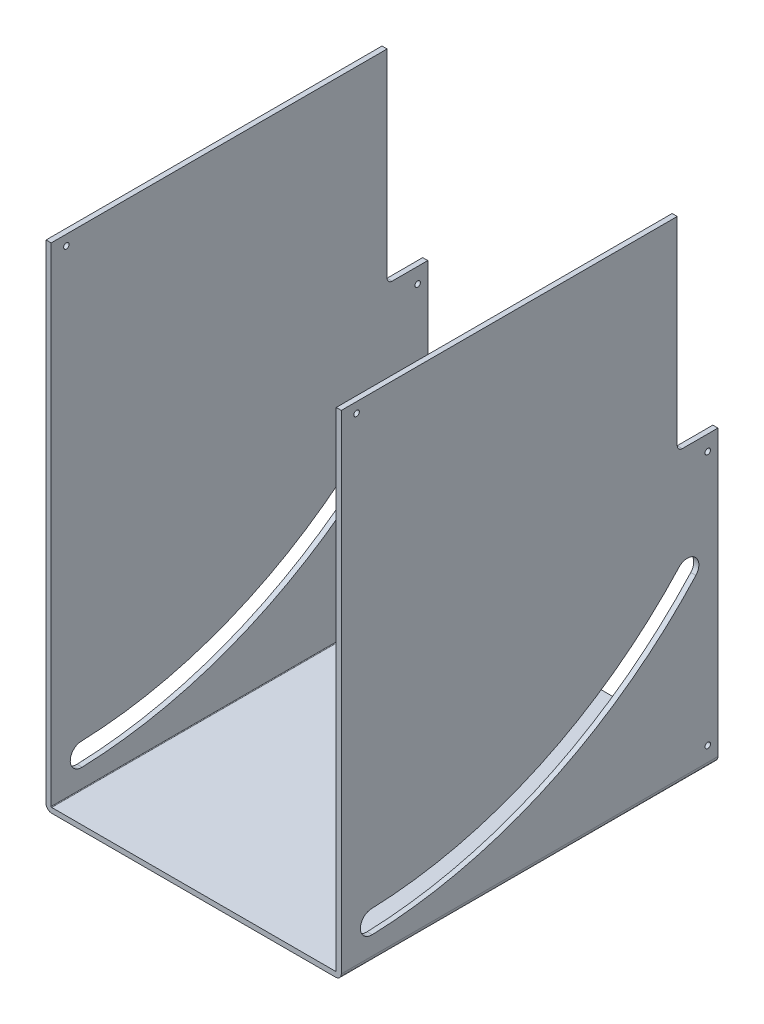
ISO-10303-21;
HEADER;
FILE_DESCRIPTION(('STEP AP214'),'2;1');
FILE_NAME('part.step','',(''),(''),'','','');
FILE_SCHEMA(('AUTOMOTIVE_DESIGN { 1 0 10303 214 1 1 1 1 }'));
ENDSEC;
DATA;
#1=APPLICATION_CONTEXT('core data for automotive mechanical design processes');
#2=APPLICATION_PROTOCOL_DEFINITION('international standard','automotive_design',2000,#1);
#3=PRODUCT_CONTEXT('',#1,'mechanical');
#4=PRODUCT('Part','Part','',(#3));
#5=PRODUCT_RELATED_PRODUCT_CATEGORY('part','',(#4));
#6=PRODUCT_DEFINITION_FORMATION('','',#4);
#7=PRODUCT_DEFINITION_CONTEXT('part definition',#1,'design');
#8=PRODUCT_DEFINITION('design','',#6,#7);
#9=PRODUCT_DEFINITION_SHAPE('','',#8);
#10=(LENGTH_UNIT() NAMED_UNIT(*) SI_UNIT(.MILLI.,.METRE.));
#11=(NAMED_UNIT(*) PLANE_ANGLE_UNIT() SI_UNIT($,.RADIAN.));
#12=(NAMED_UNIT(*) SI_UNIT($,.STERADIAN.) SOLID_ANGLE_UNIT());
#13=UNCERTAINTY_MEASURE_WITH_UNIT(LENGTH_MEASURE(1.E-05),#10,'distance_accuracy_value','');
#14=(GEOMETRIC_REPRESENTATION_CONTEXT(3) GLOBAL_UNCERTAINTY_ASSIGNED_CONTEXT((#13)) GLOBAL_UNIT_ASSIGNED_CONTEXT((#10,
#11,#12)) REPRESENTATION_CONTEXT('',''));
#15=CARTESIAN_POINT('',(0.,0.,0.));
#16=DIRECTION('',(0.,0.,1.));
#17=DIRECTION('',(1.,0.,0.));
#18=AXIS2_PLACEMENT_3D('',#15,#16,#17);
#19=CARTESIAN_POINT('',(361.95,-1.27444351368429E-12,0.));
#20=DIRECTION('',(1.,0.,0.));
#21=DIRECTION('',(0.,1.,0.));
#22=AXIS2_PLACEMENT_3D('',#19,#20,#21);
#23=PLANE('',#22);
#24=CARTESIAN_POINT('',(361.950000000002,603.25,-19.05));
#25=DIRECTION('',(-1.,0.,0.));
#26=DIRECTION('',(0.,-1.,0.));
#27=AXIS2_PLACEMENT_3D('',#24,#25,#26);
#28=CIRCLE('',#27,3.42900000000003);
#29=CARTESIAN_POINT('',(361.950000000002,599.821,-19.05));
#30=VERTEX_POINT('',#29);
#31=EDGE_CURVE('E196',#30,#30,#28,.F.);
#32=ORIENTED_EDGE('',*,*,#31,.T.);
#33=EDGE_LOOP('',(#32));
#34=FACE_BOUND('',#33,.T.);
#35=CARTESIAN_POINT('',(361.95,342.9,-457.2));
#36=DIRECTION('',(-1.,0.,0.));
#37=DIRECTION('',(0.,-1.,0.));
#38=AXIS2_PLACEMENT_3D('',#35,#36,#37);
#39=CIRCLE('',#38,3.42900000000003);
#40=CARTESIAN_POINT('',(361.95,339.471,-457.2));
#41=VERTEX_POINT('',#40);
#42=EDGE_CURVE('E322',#41,#41,#39,.F.);
#43=ORIENTED_EDGE('',*,*,#42,.T.);
#44=EDGE_LOOP('',(#43));
#45=FACE_BOUND('',#44,.T.);
#46=CARTESIAN_POINT('',(361.95,25.4000000000012,-457.2));
#47=DIRECTION('',(-1.,0.,0.));
#48=DIRECTION('',(0.,-1.,0.));
#49=AXIS2_PLACEMENT_3D('',#46,#47,#48);
#50=CIRCLE('',#49,3.429);
#51=CARTESIAN_POINT('',(361.95,21.9710000000012,-457.2));
#52=VERTEX_POINT('',#51);
#53=EDGE_CURVE('E319',#52,#52,#50,.F.);
#54=ORIENTED_EDGE('',*,*,#53,.T.);
#55=EDGE_LOOP('',(#54));
#56=FACE_BOUND('',#55,.T.);
#57=CARTESIAN_POINT('',(361.95,44.4500000000012,-38.1));
#58=DIRECTION('',(-1.,0.,0.));
#59=DIRECTION('',(0.,-1.,0.));
#60=AXIS2_PLACEMENT_3D('',#57,#58,#59);
#61=CIRCLE('',#60,14.2875);
#62=CARTESIAN_POINT('',(361.95,58.7292048343176,-37.6132089261029));
#63=VERTEX_POINT('',#62);
#64=CARTESIAN_POINT('',(361.950000000003,30.1707951656841,-38.5867910738975));
#65=VERTEX_POINT('',#64);
#66=EDGE_CURVE('E317',#63,#65,#61,.F.);
#67=ORIENTED_EDGE('',*,*,#66,.T.);
#68=CARTESIAN_POINT('',(361.950000000003,603.25,-19.05));
#69=DIRECTION('',(-1.,0.,0.));
#70=DIRECTION('',(0.,-1.,0.));
#71=AXIS2_PLACEMENT_3D('',#68,#69,#70);
#72=CIRCLE('',#71,573.412121618472);
#73=CARTESIAN_POINT('',(361.950000000002,216.441271372631,-442.347139934439));
#74=VERTEX_POINT('',#73);
#75=EDGE_CURVE('E307',#65,#74,#72,.F.);
#76=ORIENTED_EDGE('',*,*,#75,.T.);
#77=CARTESIAN_POINT('',(361.95,226.079242915097,-431.8));
#78=DIRECTION('',(-1.,0.,0.));
#79=DIRECTION('',(0.,-1.,0.));
#80=AXIS2_PLACEMENT_3D('',#77,#78,#79);
#81=CIRCLE('',#80,14.2875);
#82=CARTESIAN_POINT('',(361.95,235.717214457562,-421.252860065562));
#83=VERTEX_POINT('',#82);
#84=EDGE_CURVE('E311',#74,#83,#81,.F.);
#85=ORIENTED_EDGE('',*,*,#84,.T.);
#86=CARTESIAN_POINT('',(361.949999999998,603.25,-19.05));
#87=DIRECTION('',(-1.,0.,0.));
#88=DIRECTION('',(0.,-1.,0.));
#89=AXIS2_PLACEMENT_3D('',#86,#87,#88);
#90=CIRCLE('',#89,544.837121618472);
#91=EDGE_CURVE('E313',#63,#83,#90,.F.);
#92=ORIENTED_EDGE('',*,*,#91,.F.);
#93=EDGE_LOOP('',(#67,#76,#85,#92));
#94=FACE_BOUND('',#93,.T.);
#95=DIRECTION('',(0.,-1.,0.));
#96=VECTOR('',#95,1.);
#97=CARTESIAN_POINT('',(361.950000000002,615.95,-419.1));
#98=LINE('',#97,#96);
#99=CARTESIAN_POINT('',(361.950000000002,615.95,-419.1));
#100=VERTEX_POINT('',#99);
#101=CARTESIAN_POINT('',(361.950000000001,368.300000000003,-419.1));
#102=VERTEX_POINT('',#101);
#103=EDGE_CURVE('E165',#100,#102,#98,.T.);
#104=ORIENTED_EDGE('',*,*,#103,.T.);
#105=CARTESIAN_POINT('',(361.95,368.300000000003,-425.45));
#106=DIRECTION('',(1.,0.,0.));
#107=DIRECTION('',(0.,1.,0.));
#108=AXIS2_PLACEMENT_3D('',#105,#106,#107);
#109=CIRCLE('',#108,6.35000000000002);
#110=CARTESIAN_POINT('',(361.95,361.950000000001,-425.45));
#111=VERTEX_POINT('',#110);
#112=EDGE_CURVE('E20',#102,#111,#109,.T.);
#113=ORIENTED_EDGE('',*,*,#112,.T.);
#114=DIRECTION('',(0.,0.,1.));
#115=VECTOR('',#114,1.);
#116=CARTESIAN_POINT('',(361.95,361.95,-469.9));
#117=LINE('',#116,#115);
#118=CARTESIAN_POINT('',(361.95,361.95,-469.9));
#119=VERTEX_POINT('',#118);
#120=EDGE_CURVE('E169',#111,#119,#117,.F.);
#121=ORIENTED_EDGE('',*,*,#120,.T.);
#122=DIRECTION('',(0.,1.,0.));
#123=VECTOR('',#122,1.);
#124=CARTESIAN_POINT('',(361.95,6.34999999999997,-469.9));
#125=LINE('',#124,#123);
#126=CARTESIAN_POINT('',(361.95,7.08659999999999,-469.9));
#127=VERTEX_POINT('',#126);
#128=EDGE_CURVE('E376',#127,#119,#125,.T.);
#129=ORIENTED_EDGE('',*,*,#128,.F.);
#130=DIRECTION('',(0.,0.,-1.));
#131=VECTOR('',#130,1.);
#132=CARTESIAN_POINT('',(361.95,7.0866,-469.9));
#133=LINE('',#132,#131);
#134=CARTESIAN_POINT('',(361.950000000001,7.08659999999998,0.));
#135=VERTEX_POINT('',#134);
#136=EDGE_CURVE('E370',#127,#135,#133,.F.);
#137=ORIENTED_EDGE('',*,*,#136,.T.);
#138=DIRECTION('',(0.,1.,0.));
#139=VECTOR('',#138,1.);
#140=CARTESIAN_POINT('',(361.950000000002,615.95,0.));
#141=LINE('',#140,#139);
#142=CARTESIAN_POINT('',(361.950000000002,615.95,0.));
#143=VERTEX_POINT('',#142);
#144=EDGE_CURVE('E373',#143,#135,#141,.F.);
#145=ORIENTED_EDGE('',*,*,#144,.F.);
#146=DIRECTION('',(0.,0.,1.));
#147=VECTOR('',#146,1.);
#148=CARTESIAN_POINT('',(361.950000000002,615.95,-469.9));
#149=LINE('',#148,#147);
#150=EDGE_CURVE('E193',#100,#143,#149,.T.);
#151=ORIENTED_EDGE('',*,*,#150,.F.);
#152=EDGE_LOOP('',(#104,#113,#121,#129,#137,#145,#151));
#153=FACE_BOUND('',#152,.T.);
#154=ADVANCED_FACE('F17',(#34,#45,#56,#94,#153),#23,.F.);
#155=CARTESIAN_POINT('',(368.300000000003,361.95,-469.9));
#156=DIRECTION('',(0.,-1.,0.));
#157=DIRECTION('',(1.,0.,0.));
#158=AXIS2_PLACEMENT_3D('',#155,#156,#157);
#159=PLANE('',#158);
#160=DIRECTION('',(1.,0.,0.));
#161=VECTOR('',#160,1.);
#162=CARTESIAN_POINT('',(368.300000000003,361.950000000002,-425.45));
#163=LINE('',#162,#161);
#164=CARTESIAN_POINT('',(368.300000000003,361.950000000001,-425.45));
#165=VERTEX_POINT('',#164);
#166=EDGE_CURVE('E174',#111,#165,#163,.T.);
#167=ORIENTED_EDGE('',*,*,#166,.T.);
#168=DIRECTION('',(0.,0.,1.));
#169=VECTOR('',#168,1.);
#170=CARTESIAN_POINT('',(368.300000000001,361.95,0.));
#171=LINE('',#170,#169);
#172=CARTESIAN_POINT('',(368.300000000001,361.95,-469.9));
#173=VERTEX_POINT('',#172);
#174=EDGE_CURVE('E306',#173,#165,#171,.T.);
#175=ORIENTED_EDGE('',*,*,#174,.F.);
#176=DIRECTION('',(-1.,0.,0.));
#177=VECTOR('',#176,1.);
#178=CARTESIAN_POINT('',(368.3,361.95,-469.9));
#179=LINE('',#178,#177);
#180=EDGE_CURVE('E180',#119,#173,#179,.F.);
#181=ORIENTED_EDGE('',*,*,#180,.F.);
#182=ORIENTED_EDGE('',*,*,#120,.F.);
#183=EDGE_LOOP('',(#167,#175,#181,#182));
#184=FACE_BOUND('',#183,.T.);
#185=ADVANCED_FACE('F176',(#184),#159,.F.);
#186=CARTESIAN_POINT('',(368.300000000003,368.300000000003,-425.45));
#187=DIRECTION('',(1.,0.,0.));
#188=DIRECTION('',(0.,1.,0.));
#189=AXIS2_PLACEMENT_3D('',#186,#187,#188);
#190=CYLINDRICAL_SURFACE('',#189,6.35000000000002);
#191=ORIENTED_EDGE('',*,*,#166,.F.);
#192=ORIENTED_EDGE('',*,*,#112,.F.);
#193=DIRECTION('',(1.,0.,0.));
#194=VECTOR('',#193,1.);
#195=CARTESIAN_POINT('',(368.300000000003,368.300000000003,-419.1));
#196=LINE('',#195,#194);
#197=CARTESIAN_POINT('',(368.300000000002,368.300000000003,-419.1));
#198=VERTEX_POINT('',#197);
#199=EDGE_CURVE('E188',#102,#198,#196,.T.);
#200=ORIENTED_EDGE('',*,*,#199,.T.);
#201=CARTESIAN_POINT('',(368.300000000003,368.300000000003,-425.45));
#202=DIRECTION('',(1.,0.,0.));
#203=DIRECTION('',(0.,1.,0.));
#204=AXIS2_PLACEMENT_3D('',#201,#202,#203);
#205=CIRCLE('',#204,6.35000000000002);
#206=EDGE_CURVE('E185',#165,#198,#205,.F.);
#207=ORIENTED_EDGE('',*,*,#206,.F.);
#208=EDGE_LOOP('',(#191,#192,#200,#207));
#209=FACE_BOUND('',#208,.T.);
#210=ADVANCED_FACE('F183',(#209),#190,.F.);
#211=CARTESIAN_POINT('',(368.300000000003,615.95,-419.1));
#212=DIRECTION('',(0.,0.,1.));
#213=DIRECTION('',(0.,-1.,0.));
#214=AXIS2_PLACEMENT_3D('',#211,#212,#213);
#215=PLANE('',#214);
#216=ORIENTED_EDGE('',*,*,#199,.F.);
#217=ORIENTED_EDGE('',*,*,#103,.F.);
#218=DIRECTION('',(-1.,0.,0.));
#219=VECTOR('',#218,1.);
#220=CARTESIAN_POINT('',(368.300000000003,615.95,-419.1));
#221=LINE('',#220,#219);
#222=CARTESIAN_POINT('',(368.300000000002,615.95,-419.1));
#223=VERTEX_POINT('',#222);
#224=EDGE_CURVE('E197',#223,#100,#221,.T.);
#225=ORIENTED_EDGE('',*,*,#224,.F.);
#226=DIRECTION('',(0.,1.,0.));
#227=VECTOR('',#226,1.);
#228=CARTESIAN_POINT('',(368.3,-1.29661442018595E-12,-419.1));
#229=LINE('',#228,#227);
#230=EDGE_CURVE('E305',#198,#223,#229,.T.);
#231=ORIENTED_EDGE('',*,*,#230,.F.);
#232=EDGE_LOOP('',(#216,#217,#225,#231));
#233=FACE_BOUND('',#232,.T.);
#234=ADVANCED_FACE('F407',(#233),#215,.F.);
#235=CARTESIAN_POINT('',(368.300000000003,615.95,-469.9));
#236=DIRECTION('',(0.,1.,0.));
#237=DIRECTION('',(-1.,0.,0.));
#238=AXIS2_PLACEMENT_3D('',#235,#236,#237);
#239=PLANE('',#238);
#240=DIRECTION('',(1.,0.,0.));
#241=VECTOR('',#240,1.);
#242=CARTESIAN_POINT('',(368.300000000003,615.95,0.));
#243=LINE('',#242,#241);
#244=CARTESIAN_POINT('',(368.300000000002,615.95,0.));
#245=VERTEX_POINT('',#244);
#246=EDGE_CURVE('E372',#245,#143,#243,.F.);
#247=ORIENTED_EDGE('',*,*,#246,.F.);
#248=DIRECTION('',(0.,0.,1.));
#249=VECTOR('',#248,1.);
#250=CARTESIAN_POINT('',(368.300000000002,615.95,0.));
#251=LINE('',#250,#249);
#252=EDGE_CURVE('E363',#223,#245,#251,.T.);
#253=ORIENTED_EDGE('',*,*,#252,.F.);
#254=ORIENTED_EDGE('',*,*,#224,.T.);
#255=ORIENTED_EDGE('',*,*,#150,.T.);
#256=EDGE_LOOP('',(#247,#253,#254,#255));
#257=FACE_BOUND('',#256,.T.);
#258=ADVANCED_FACE('F333',(#257),#239,.T.);
#259=CARTESIAN_POINT('',(368.300000000003,603.25,-19.05));
#260=DIRECTION('',(-1.,0.,0.));
#261=DIRECTION('',(0.,-1.,0.));
#262=AXIS2_PLACEMENT_3D('',#259,#260,#261);
#263=CYLINDRICAL_SURFACE('',#262,3.42900000000003);
#264=ORIENTED_EDGE('',*,*,#31,.F.);
#265=EDGE_LOOP('',(#264));
#266=FACE_BOUND('',#265,.T.);
#267=CARTESIAN_POINT('',(368.300000000003,603.25,-19.05));
#268=DIRECTION('',(-1.,0.,0.));
#269=DIRECTION('',(0.,-1.,0.));
#270=AXIS2_PLACEMENT_3D('',#267,#268,#269);
#271=CIRCLE('',#270,3.42900000000003);
#272=CARTESIAN_POINT('',(368.300000000003,599.821,-19.05));
#273=VERTEX_POINT('',#272);
#274=EDGE_CURVE('E300',#273,#273,#271,.T.);
#275=ORIENTED_EDGE('',*,*,#274,.F.);
#276=EDGE_LOOP('',(#275));
#277=FACE_BOUND('',#276,.T.);
#278=ADVANCED_FACE('F329',(#266,#277),#263,.F.);
#279=CARTESIAN_POINT('',(368.300000000003,342.9,-457.2));
#280=DIRECTION('',(-1.,0.,0.));
#281=DIRECTION('',(0.,-1.,0.));
#282=AXIS2_PLACEMENT_3D('',#279,#280,#281);
#283=CYLINDRICAL_SURFACE('',#282,3.42900000000003);
#284=ORIENTED_EDGE('',*,*,#42,.F.);
#285=EDGE_LOOP('',(#284));
#286=FACE_BOUND('',#285,.T.);
#287=CARTESIAN_POINT('',(368.300000000003,342.9,-457.2));
#288=DIRECTION('',(-1.,0.,0.));
#289=DIRECTION('',(0.,-1.,0.));
#290=AXIS2_PLACEMENT_3D('',#287,#288,#289);
#291=CIRCLE('',#290,3.42900000000003);
#292=CARTESIAN_POINT('',(368.300000000003,339.471,-457.2));
#293=VERTEX_POINT('',#292);
#294=EDGE_CURVE('E297',#293,#293,#291,.T.);
#295=ORIENTED_EDGE('',*,*,#294,.F.);
#296=EDGE_LOOP('',(#295));
#297=FACE_BOUND('',#296,.T.);
#298=ADVANCED_FACE('F332',(#286,#297),#283,.F.);
#299=CARTESIAN_POINT('',(368.300000000005,25.4000000000013,-457.2));
#300=DIRECTION('',(-1.,0.,0.));
#301=DIRECTION('',(0.,-1.,0.));
#302=AXIS2_PLACEMENT_3D('',#299,#300,#301);
#303=CYLINDRICAL_SURFACE('',#302,3.429);
#304=ORIENTED_EDGE('',*,*,#53,.F.);
#305=EDGE_LOOP('',(#304));
#306=FACE_BOUND('',#305,.T.);
#307=CARTESIAN_POINT('',(368.300000000005,25.4000000000013,-457.2));
#308=DIRECTION('',(-1.,0.,0.));
#309=DIRECTION('',(0.,-1.,0.));
#310=AXIS2_PLACEMENT_3D('',#307,#308,#309);
#311=CIRCLE('',#310,3.429);
#312=CARTESIAN_POINT('',(368.300000000005,21.9710000000013,-457.2));
#313=VERTEX_POINT('',#312);
#314=EDGE_CURVE('E294',#313,#313,#311,.T.);
#315=ORIENTED_EDGE('',*,*,#314,.F.);
#316=EDGE_LOOP('',(#315));
#317=FACE_BOUND('',#316,.T.);
#318=ADVANCED_FACE('F772',(#306,#317),#303,.F.);
#319=CARTESIAN_POINT('',(368.300000000005,44.4500000000013,-38.1));
#320=DIRECTION('',(-1.,0.,0.));
#321=DIRECTION('',(0.,-1.,0.));
#322=AXIS2_PLACEMENT_3D('',#319,#320,#321);
#323=CYLINDRICAL_SURFACE('',#322,14.2875);
#324=DIRECTION('',(-1.,0.,0.));
#325=VECTOR('',#324,1.);
#326=CARTESIAN_POINT('',(368.300000000007,30.1707951656837,-38.5867910738979));
#327=LINE('',#326,#325);
#328=CARTESIAN_POINT('',(368.300000000005,30.1707951656841,-38.5867910738975));
#329=VERTEX_POINT('',#328);
#330=EDGE_CURVE('E383',#329,#65,#327,.T.);
#331=ORIENTED_EDGE('',*,*,#330,.T.);
#332=ORIENTED_EDGE('',*,*,#66,.F.);
#333=DIRECTION('',(-1.,0.,0.));
#334=VECTOR('',#333,1.);
#335=CARTESIAN_POINT('',(368.300000000007,58.7292048343172,-37.613208926103));
#336=LINE('',#335,#334);
#337=CARTESIAN_POINT('',(368.300000000003,58.7292048343172,-37.613208926103));
#338=VERTEX_POINT('',#337);
#339=EDGE_CURVE('E316',#338,#63,#336,.T.);
#340=ORIENTED_EDGE('',*,*,#339,.F.);
#341=CARTESIAN_POINT('',(368.300000000005,44.4500000000013,-38.1));
#342=DIRECTION('',(-1.,0.,0.));
#343=DIRECTION('',(0.,-1.,0.));
#344=AXIS2_PLACEMENT_3D('',#341,#342,#343);
#345=CIRCLE('',#344,14.2875);
#346=EDGE_CURVE('E291',#329,#338,#345,.T.);
#347=ORIENTED_EDGE('',*,*,#346,.F.);
#348=EDGE_LOOP('',(#331,#332,#340,#347));
#349=FACE_BOUND('',#348,.T.);
#350=ADVANCED_FACE('F763',(#349),#323,.F.);
#351=CARTESIAN_POINT('',(368.300000000005,603.25,-19.05));
#352=DIRECTION('',(-1.,0.,0.));
#353=DIRECTION('',(0.,-1.,0.));
#354=AXIS2_PLACEMENT_3D('',#351,#352,#353);
#355=CYLINDRICAL_SURFACE('',#354,544.837121618472);
#356=ORIENTED_EDGE('',*,*,#339,.T.);
#357=ORIENTED_EDGE('',*,*,#91,.T.);
#358=DIRECTION('',(-1.,0.,0.));
#359=VECTOR('',#358,1.);
#360=CARTESIAN_POINT('',(368.300000000005,235.717214457562,-421.252860065562));
#361=LINE('',#360,#359);
#362=CARTESIAN_POINT('',(368.3,235.717214457562,-421.252860065562));
#363=VERTEX_POINT('',#362);
#364=EDGE_CURVE('E310',#83,#363,#361,.F.);
#365=ORIENTED_EDGE('',*,*,#364,.T.);
#366=CARTESIAN_POINT('',(368.299999999999,603.25,-19.05));
#367=DIRECTION('',(-1.,0.,0.));
#368=DIRECTION('',(0.,-1.,0.));
#369=AXIS2_PLACEMENT_3D('',#366,#367,#368);
#370=CIRCLE('',#369,544.837121618472);
#371=EDGE_CURVE('E288',#338,#363,#370,.F.);
#372=ORIENTED_EDGE('',*,*,#371,.F.);
#373=EDGE_LOOP('',(#356,#357,#365,#372));
#374=FACE_BOUND('',#373,.T.);
#375=ADVANCED_FACE('F754',(#374),#355,.T.);
#376=CARTESIAN_POINT('',(368.300000000005,226.079242915097,-431.8));
#377=DIRECTION('',(-1.,0.,0.));
#378=DIRECTION('',(0.,-1.,0.));
#379=AXIS2_PLACEMENT_3D('',#376,#377,#378);
#380=CYLINDRICAL_SURFACE('',#379,14.2875);
#381=CARTESIAN_POINT('',(368.3,226.079242915097,-431.8));
#382=DIRECTION('',(-1.,0.,0.));
#383=DIRECTION('',(0.,-1.,0.));
#384=AXIS2_PLACEMENT_3D('',#381,#382,#383);
#385=CIRCLE('',#384,14.2875);
#386=CARTESIAN_POINT('',(368.300000000003,216.441271372631,-442.347139934439));
#387=VERTEX_POINT('',#386);
#388=EDGE_CURVE('E285',#363,#387,#385,.T.);
#389=ORIENTED_EDGE('',*,*,#388,.F.);
#390=ORIENTED_EDGE('',*,*,#364,.F.);
#391=ORIENTED_EDGE('',*,*,#84,.F.);
#392=DIRECTION('',(-1.,0.,0.));
#393=VECTOR('',#392,1.);
#394=CARTESIAN_POINT('',(368.300000000006,216.441271372631,-442.347139934439));
#395=LINE('',#394,#393);
#396=EDGE_CURVE('E309',#74,#387,#395,.F.);
#397=ORIENTED_EDGE('',*,*,#396,.T.);
#398=EDGE_LOOP('',(#389,#390,#391,#397));
#399=FACE_BOUND('',#398,.T.);
#400=ADVANCED_FACE('F745',(#399),#380,.F.);
#401=CARTESIAN_POINT('',(368.300000000005,603.25,-19.05));
#402=DIRECTION('',(-1.,0.,0.));
#403=DIRECTION('',(0.,-1.,0.));
#404=AXIS2_PLACEMENT_3D('',#401,#402,#403);
#405=CYLINDRICAL_SURFACE('',#404,573.412121618472);
#406=CARTESIAN_POINT('',(368.300000000004,603.25,-19.05));
#407=DIRECTION('',(-1.,0.,0.));
#408=DIRECTION('',(0.,-1.,0.));
#409=AXIS2_PLACEMENT_3D('',#406,#407,#408);
#410=CIRCLE('',#409,573.412121618472);
#411=EDGE_CURVE('E282',#387,#329,#410,.T.);
#412=ORIENTED_EDGE('',*,*,#411,.F.);
#413=ORIENTED_EDGE('',*,*,#396,.F.);
#414=ORIENTED_EDGE('',*,*,#75,.F.);
#415=ORIENTED_EDGE('',*,*,#330,.F.);
#416=EDGE_LOOP('',(#412,#413,#414,#415));
#417=FACE_BOUND('',#416,.T.);
#418=ADVANCED_FACE('F736',(#417),#405,.F.);
#419=CARTESIAN_POINT('',(361.2134,7.0866,-469.9));
#420=DIRECTION('',(0.,0.,-1.));
#421=DIRECTION('',(-1.,0.,0.));
#422=AXIS2_PLACEMENT_3D('',#419,#420,#421);
#423=CYLINDRICAL_SURFACE('',#422,0.736599999999977);
#424=CARTESIAN_POINT('',(361.2134,7.0866,0.));
#425=DIRECTION('',(0.,0.,-1.));
#426=DIRECTION('',(-1.,0.,0.));
#427=AXIS2_PLACEMENT_3D('',#424,#425,#426);
#428=CIRCLE('',#427,0.736599999999977);
#429=CARTESIAN_POINT('',(361.2134,6.35000000000001,0.));
#430=VERTEX_POINT('',#429);
#431=EDGE_CURVE('E277',#135,#430,#428,.T.);
#432=ORIENTED_EDGE('',*,*,#431,.F.);
#433=ORIENTED_EDGE('',*,*,#136,.F.);
#434=CARTESIAN_POINT('',(361.2134,7.0866,-469.9));
#435=DIRECTION('',(0.,0.,-1.));
#436=DIRECTION('',(-1.,0.,0.));
#437=AXIS2_PLACEMENT_3D('',#434,#435,#436);
#438=CIRCLE('',#437,0.736599999999977);
#439=CARTESIAN_POINT('',(361.2134,6.35000000000001,-469.9));
#440=VERTEX_POINT('',#439);
#441=EDGE_CURVE('E280',#127,#440,#438,.T.);
#442=ORIENTED_EDGE('',*,*,#441,.T.);
#443=DIRECTION('',(0.,0.,-1.));
#444=VECTOR('',#443,1.);
#445=CARTESIAN_POINT('',(361.2134,6.35,0.));
#446=LINE('',#445,#444);
#447=EDGE_CURVE('E276',#440,#430,#446,.F.);
#448=ORIENTED_EDGE('',*,*,#447,.T.);
#449=EDGE_LOOP('',(#432,#433,#442,#448));
#450=FACE_BOUND('',#449,.T.);
#451=ADVANCED_FACE('F341',(#450),#423,.F.);
#452=CARTESIAN_POINT('',(368.3,-1.29661442018595E-12,0.));
#453=DIRECTION('',(1.,0.,0.));
#454=DIRECTION('',(0.,1.,0.));
#455=AXIS2_PLACEMENT_3D('',#452,#453,#454);
#456=PLANE('',#455);
#457=ORIENTED_EDGE('',*,*,#388,.T.);
#458=ORIENTED_EDGE('',*,*,#411,.T.);
#459=ORIENTED_EDGE('',*,*,#346,.T.);
#460=ORIENTED_EDGE('',*,*,#371,.T.);
#461=EDGE_LOOP('',(#457,#458,#459,#460));
#462=FACE_BOUND('',#461,.T.);
#463=ORIENTED_EDGE('',*,*,#314,.T.);
#464=EDGE_LOOP('',(#463));
#465=FACE_BOUND('',#464,.T.);
#466=ORIENTED_EDGE('',*,*,#294,.T.);
#467=EDGE_LOOP('',(#466));
#468=FACE_BOUND('',#467,.T.);
#469=ORIENTED_EDGE('',*,*,#274,.T.);
#470=EDGE_LOOP('',(#469));
#471=FACE_BOUND('',#470,.T.);
#472=DIRECTION('',(0.,0.,-1.));
#473=VECTOR('',#472,1.);
#474=CARTESIAN_POINT('',(368.3,7.08659999999998,-469.9));
#475=LINE('',#474,#473);
#476=CARTESIAN_POINT('',(368.3,7.08659999999998,-469.9));
#477=VERTEX_POINT('',#476);
#478=CARTESIAN_POINT('',(368.3,7.08659999999998,0.));
#479=VERTEX_POINT('',#478);
#480=EDGE_CURVE('E272',#477,#479,#475,.F.);
#481=ORIENTED_EDGE('',*,*,#480,.F.);
#482=DIRECTION('',(0.,1.,0.));
#483=VECTOR('',#482,1.);
#484=CARTESIAN_POINT('',(368.3,-1.29661442018595E-12,-469.9));
#485=LINE('',#484,#483);
#486=EDGE_CURVE('E303',#477,#173,#485,.T.);
#487=ORIENTED_EDGE('',*,*,#486,.T.);
#488=ORIENTED_EDGE('',*,*,#174,.T.);
#489=ORIENTED_EDGE('',*,*,#206,.T.);
#490=ORIENTED_EDGE('',*,*,#230,.T.);
#491=ORIENTED_EDGE('',*,*,#252,.T.);
#492=DIRECTION('',(0.,1.,0.));
#493=VECTOR('',#492,1.);
#494=CARTESIAN_POINT('',(368.3,-1.29661442018595E-12,0.));
#495=LINE('',#494,#493);
#496=EDGE_CURVE('E349',#245,#479,#495,.F.);
#497=ORIENTED_EDGE('',*,*,#496,.T.);
#498=EDGE_LOOP('',(#481,#487,#488,#489,#490,#491,#497));
#499=FACE_BOUND('',#498,.T.);
#500=ADVANCED_FACE('F337',(#462,#465,#468,#471,#499),#456,.T.);
#501=CARTESIAN_POINT('',(0.,6.35,0.));
#502=DIRECTION('',(0.,-1.,0.));
#503=DIRECTION('',(0.,0.,-1.));
#504=AXIS2_PLACEMENT_3D('',#501,#502,#503);
#505=PLANE('',#504);
#506=DIRECTION('',(-1.,0.,0.));
#507=VECTOR('',#506,1.);
#508=CARTESIAN_POINT('',(0.,6.35,0.));
#509=LINE('',#508,#507);
#510=CARTESIAN_POINT('',(7.0866,6.35,0.));
#511=VERTEX_POINT('',#510);
#512=EDGE_CURVE('E418',#511,#430,#509,.F.);
#513=ORIENTED_EDGE('',*,*,#512,.T.);
#514=ORIENTED_EDGE('',*,*,#447,.F.);
#515=DIRECTION('',(1.,0.,0.));
#516=VECTOR('',#515,1.);
#517=CARTESIAN_POINT('',(0.,6.35000000000002,-469.9));
#518=LINE('',#517,#516);
#519=CARTESIAN_POINT('',(7.0866,6.35000000000001,-469.9));
#520=VERTEX_POINT('',#519);
#521=EDGE_CURVE('E271',#440,#520,#518,.F.);
#522=ORIENTED_EDGE('',*,*,#521,.T.);
#523=DIRECTION('',(0.,0.,1.));
#524=VECTOR('',#523,1.);
#525=CARTESIAN_POINT('',(7.0866,6.35,0.));
#526=LINE('',#525,#524);
#527=EDGE_CURVE('E421',#520,#511,#526,.T.);
#528=ORIENTED_EDGE('',*,*,#527,.T.);
#529=EDGE_LOOP('',(#513,#514,#522,#528));
#530=FACE_BOUND('',#529,.T.);
#531=ADVANCED_FACE('F340',(#530),#505,.F.);
#532=CARTESIAN_POINT('',(361.2134,7.0866,-469.9));
#533=DIRECTION('',(0.,0.,-1.));
#534=DIRECTION('',(-1.,0.,0.));
#535=AXIS2_PLACEMENT_3D('',#532,#533,#534);
#536=CYLINDRICAL_SURFACE('',#535,7.0866);
#537=ORIENTED_EDGE('',*,*,#480,.T.);
#538=CARTESIAN_POINT('',(361.2134,7.0866,0.));
#539=DIRECTION('',(0.,0.,-1.));
#540=DIRECTION('',(-1.,0.,0.));
#541=AXIS2_PLACEMENT_3D('',#538,#539,#540);
#542=CIRCLE('',#541,7.0866);
#543=CARTESIAN_POINT('',(361.2134,0.,0.));
#544=VERTEX_POINT('',#543);
#545=EDGE_CURVE('E268',#479,#544,#542,.T.);
#546=ORIENTED_EDGE('',*,*,#545,.T.);
#547=DIRECTION('',(0.,0.,-1.));
#548=VECTOR('',#547,1.);
#549=CARTESIAN_POINT('',(361.2134,0.,0.));
#550=LINE('',#549,#548);
#551=CARTESIAN_POINT('',(361.2134,0.,-469.9));
#552=VERTEX_POINT('',#551);
#553=EDGE_CURVE('E267',#552,#544,#550,.F.);
#554=ORIENTED_EDGE('',*,*,#553,.F.);
#555=CARTESIAN_POINT('',(361.2134,7.0866,-469.9));
#556=DIRECTION('',(0.,0.,-1.));
#557=DIRECTION('',(-1.,0.,0.));
#558=AXIS2_PLACEMENT_3D('',#555,#556,#557);
#559=CIRCLE('',#558,7.0866);
#560=EDGE_CURVE('E273',#552,#477,#559,.F.);
#561=ORIENTED_EDGE('',*,*,#560,.T.);
#562=EDGE_LOOP('',(#537,#546,#554,#561));
#563=FACE_BOUND('',#562,.T.);
#564=ADVANCED_FACE('F354',(#563),#536,.T.);
#565=CARTESIAN_POINT('',(7.0866,7.0866,0.));
#566=DIRECTION('',(0.,0.,1.));
#567=DIRECTION('',(1.,0.,0.));
#568=AXIS2_PLACEMENT_3D('',#565,#566,#567);
#569=CYLINDRICAL_SURFACE('',#568,0.7366);
#570=CARTESIAN_POINT('',(7.0866,7.0866,-469.9));
#571=DIRECTION('',(0.,0.,1.));
#572=DIRECTION('',(1.,0.,0.));
#573=AXIS2_PLACEMENT_3D('',#570,#571,#572);
#574=CIRCLE('',#573,0.7366);
#575=CARTESIAN_POINT('',(6.34999999999938,7.08660000000003,-469.9));
#576=VERTEX_POINT('',#575);
#577=EDGE_CURVE('E264',#576,#520,#574,.T.);
#578=ORIENTED_EDGE('',*,*,#577,.F.);
#579=DIRECTION('',(0.,0.,1.));
#580=VECTOR('',#579,1.);
#581=CARTESIAN_POINT('',(6.35,7.0866,0.));
#582=LINE('',#581,#580);
#583=CARTESIAN_POINT('',(6.35,7.08659999999999,0.));
#584=VERTEX_POINT('',#583);
#585=EDGE_CURVE('E263',#576,#584,#582,.T.);
#586=ORIENTED_EDGE('',*,*,#585,.T.);
#587=CARTESIAN_POINT('',(7.0866,7.0866,0.));
#588=DIRECTION('',(0.,0.,1.));
#589=DIRECTION('',(1.,0.,0.));
#590=AXIS2_PLACEMENT_3D('',#587,#588,#589);
#591=CIRCLE('',#590,0.7366);
#592=EDGE_CURVE('E260',#584,#511,#591,.T.);
#593=ORIENTED_EDGE('',*,*,#592,.T.);
#594=ORIENTED_EDGE('',*,*,#527,.F.);
#595=EDGE_LOOP('',(#578,#586,#593,#594));
#596=FACE_BOUND('',#595,.T.);
#597=ADVANCED_FACE('F540',(#596),#569,.F.);
#598=CARTESIAN_POINT('',(0.,0.,0.));
#599=DIRECTION('',(0.,-1.,0.));
#600=DIRECTION('',(0.,0.,-1.));
#601=AXIS2_PLACEMENT_3D('',#598,#599,#600);
#602=PLANE('',#601);
#603=DIRECTION('',(1.,0.,0.));
#604=VECTOR('',#603,1.);
#605=CARTESIAN_POINT('',(0.,0.,-469.9));
#606=LINE('',#605,#604);
#607=CARTESIAN_POINT('',(7.0866,0.,-469.9));
#608=VERTEX_POINT('',#607);
#609=EDGE_CURVE('E360',#608,#552,#606,.T.);
#610=ORIENTED_EDGE('',*,*,#609,.T.);
#611=ORIENTED_EDGE('',*,*,#553,.T.);
#612=DIRECTION('',(1.,0.,0.));
#613=VECTOR('',#612,1.);
#614=CARTESIAN_POINT('',(0.,0.,0.));
#615=LINE('',#614,#613);
#616=CARTESIAN_POINT('',(7.0866,0.,0.));
#617=VERTEX_POINT('',#616);
#618=EDGE_CURVE('E423',#544,#617,#615,.F.);
#619=ORIENTED_EDGE('',*,*,#618,.T.);
#620=DIRECTION('',(0.,0.,1.));
#621=VECTOR('',#620,1.);
#622=CARTESIAN_POINT('',(7.0866,0.,0.));
#623=LINE('',#622,#621);
#624=EDGE_CURVE('E254',#608,#617,#623,.T.);
#625=ORIENTED_EDGE('',*,*,#624,.F.);
#626=EDGE_LOOP('',(#610,#611,#619,#625));
#627=FACE_BOUND('',#626,.T.);
#628=ADVANCED_FACE('F537',(#627),#602,.T.);
#629=CARTESIAN_POINT('',(6.35000000000002,0.,0.));
#630=DIRECTION('',(-1.,0.,0.));
#631=DIRECTION('',(0.,-1.,0.));
#632=AXIS2_PLACEMENT_3D('',#629,#630,#631);
#633=PLANE('',#632);
#634=CARTESIAN_POINT('',(6.34999999999791,603.249999999999,-19.05));
#635=DIRECTION('',(-1.,0.,0.));
#636=DIRECTION('',(0.,-1.,0.));
#637=AXIS2_PLACEMENT_3D('',#634,#635,#636);
#638=CIRCLE('',#637,3.42900000000003);
#639=CARTESIAN_POINT('',(6.34999999999792,599.820999999999,-19.05));
#640=VERTEX_POINT('',#639);
#641=EDGE_CURVE('E244',#640,#640,#638,.T.);
#642=ORIENTED_EDGE('',*,*,#641,.T.);
#643=EDGE_LOOP('',(#642));
#644=FACE_BOUND('',#643,.T.);
#645=CARTESIAN_POINT('',(6.3499999999988,342.899999999999,-457.2));
#646=DIRECTION('',(-1.,0.,0.));
#647=DIRECTION('',(0.,-1.,0.));
#648=AXIS2_PLACEMENT_3D('',#645,#646,#647);
#649=CIRCLE('',#648,3.42900000000003);
#650=CARTESIAN_POINT('',(6.34999999999881,339.470999999999,-457.2));
#651=VERTEX_POINT('',#650);
#652=EDGE_CURVE('E241',#651,#651,#649,.T.);
#653=ORIENTED_EDGE('',*,*,#652,.T.);
#654=EDGE_LOOP('',(#653));
#655=FACE_BOUND('',#654,.T.);
#656=CARTESIAN_POINT('',(6.34999999999991,25.4,-457.2));
#657=DIRECTION('',(-1.,0.,0.));
#658=DIRECTION('',(0.,-1.,0.));
#659=AXIS2_PLACEMENT_3D('',#656,#657,#658);
#660=CIRCLE('',#659,3.429);
#661=CARTESIAN_POINT('',(6.34999999999992,21.971,-457.2));
#662=VERTEX_POINT('',#661);
#663=EDGE_CURVE('E238',#662,#662,#660,.T.);
#664=ORIENTED_EDGE('',*,*,#663,.T.);
#665=EDGE_LOOP('',(#664));
#666=FACE_BOUND('',#665,.T.);
#667=CARTESIAN_POINT('',(6.34999999999986,44.45,-38.1));
#668=DIRECTION('',(-1.,0.,0.));
#669=DIRECTION('',(0.,-1.,0.));
#670=AXIS2_PLACEMENT_3D('',#667,#668,#669);
#671=CIRCLE('',#670,14.2875);
#672=CARTESIAN_POINT('',(6.34999999999994,30.1707951656824,-38.5867910738975));
#673=VERTEX_POINT('',#672);
#674=CARTESIAN_POINT('',(6.3499999999998,58.7292048343163,-37.6132089261029));
#675=VERTEX_POINT('',#674);
#676=EDGE_CURVE('E236',#673,#675,#671,.T.);
#677=ORIENTED_EDGE('',*,*,#676,.T.);
#678=CARTESIAN_POINT('',(6.34999999999791,603.249999999999,-19.05));
#679=DIRECTION('',(-1.,0.,0.));
#680=DIRECTION('',(0.,-1.,0.));
#681=AXIS2_PLACEMENT_3D('',#678,#679,#680);
#682=CIRCLE('',#681,544.837121618472);
#683=CARTESIAN_POINT('',(6.3499999999992,235.717214457561,-421.252860065562));
#684=VERTEX_POINT('',#683);
#685=EDGE_CURVE('E227',#684,#675,#682,.T.);
#686=ORIENTED_EDGE('',*,*,#685,.F.);
#687=CARTESIAN_POINT('',(6.34999999999924,226.079242915096,-431.8));
#688=DIRECTION('',(-1.,0.,0.));
#689=DIRECTION('',(0.,-1.,0.));
#690=AXIS2_PLACEMENT_3D('',#687,#688,#689);
#691=CIRCLE('',#690,14.2875);
#692=CARTESIAN_POINT('',(6.34999999999929,216.44127137263,-442.347139934438));
#693=VERTEX_POINT('',#692);
#694=EDGE_CURVE('E230',#684,#693,#691,.T.);
#695=ORIENTED_EDGE('',*,*,#694,.T.);
#696=CARTESIAN_POINT('',(6.34999999999797,603.249999999999,-19.05));
#697=DIRECTION('',(-1.,0.,0.));
#698=DIRECTION('',(0.,-1.,0.));
#699=AXIS2_PLACEMENT_3D('',#696,#697,#698);
#700=CIRCLE('',#699,573.412121618472);
#701=EDGE_CURVE('E234',#693,#673,#700,.T.);
#702=ORIENTED_EDGE('',*,*,#701,.T.);
#703=EDGE_LOOP('',(#677,#686,#695,#702));
#704=FACE_BOUND('',#703,.T.);
#705=CARTESIAN_POINT('',(6.34999999999875,368.300000000001,-425.45));
#706=DIRECTION('',(1.,0.,0.));
#707=DIRECTION('',(0.,1.,0.));
#708=AXIS2_PLACEMENT_3D('',#705,#706,#707);
#709=CIRCLE('',#708,6.35000000000002);
#710=CARTESIAN_POINT('',(6.34999999999876,361.949999999999,-425.45));
#711=VERTEX_POINT('',#710);
#712=CARTESIAN_POINT('',(6.34999999999875,368.300000000001,-419.1));
#713=VERTEX_POINT('',#712);
#714=EDGE_CURVE('E255',#711,#713,#709,.F.);
#715=ORIENTED_EDGE('',*,*,#714,.T.);
#716=DIRECTION('',(0.,-1.,0.));
#717=VECTOR('',#716,1.);
#718=CARTESIAN_POINT('',(6.34999999999875,615.95,-419.1));
#719=LINE('',#718,#717);
#720=CARTESIAN_POINT('',(6.34999999999816,615.95,-419.1));
#721=VERTEX_POINT('',#720);
#722=EDGE_CURVE('E438',#713,#721,#719,.F.);
#723=ORIENTED_EDGE('',*,*,#722,.T.);
#724=DIRECTION('',(0.,0.,1.));
#725=VECTOR('',#724,1.);
#726=CARTESIAN_POINT('',(6.34999999999787,615.95,0.));
#727=LINE('',#726,#725);
#728=CARTESIAN_POINT('',(6.34999999999893,615.95,0.));
#729=VERTEX_POINT('',#728);
#730=EDGE_CURVE('E247',#729,#721,#727,.F.);
#731=ORIENTED_EDGE('',*,*,#730,.F.);
#732=DIRECTION('',(0.,1.,0.));
#733=VECTOR('',#732,1.);
#734=CARTESIAN_POINT('',(6.35,6.34999999999997,0.));
#735=LINE('',#734,#733);
#736=EDGE_CURVE('E251',#584,#729,#735,.T.);
#737=ORIENTED_EDGE('',*,*,#736,.F.);
#738=ORIENTED_EDGE('',*,*,#585,.F.);
#739=DIRECTION('',(0.,1.,0.));
#740=VECTOR('',#739,1.);
#741=CARTESIAN_POINT('',(6.34999999999876,615.95,-469.9));
#742=LINE('',#741,#740);
#743=CARTESIAN_POINT('',(6.34999999999875,361.95,-469.9));
#744=VERTEX_POINT('',#743);
#745=EDGE_CURVE('E430',#744,#576,#742,.F.);
#746=ORIENTED_EDGE('',*,*,#745,.F.);
#747=DIRECTION('',(0.,0.,1.));
#748=VECTOR('',#747,1.);
#749=CARTESIAN_POINT('',(6.34999999999875,361.949999999999,-469.9));
#750=LINE('',#749,#748);
#751=EDGE_CURVE('E258',#744,#711,#750,.T.);
#752=ORIENTED_EDGE('',*,*,#751,.T.);
#753=EDGE_LOOP('',(#715,#723,#731,#737,#738,#746,#752));
#754=FACE_BOUND('',#753,.T.);
#755=ADVANCED_FACE('F539',(#644,#655,#666,#704,#754),#633,.F.);
#756=CARTESIAN_POINT('',(368.300000000003,615.95,-419.1));
#757=DIRECTION('',(0.,0.,1.));
#758=DIRECTION('',(0.,-1.,0.));
#759=AXIS2_PLACEMENT_3D('',#756,#757,#758);
#760=PLANE('',#759);
#761=DIRECTION('',(1.,0.,0.));
#762=VECTOR('',#761,1.);
#763=CARTESIAN_POINT('',(368.300000000003,368.300000000001,-419.1));
#764=LINE('',#763,#762);
#765=CARTESIAN_POINT('',(-1.27340765171625E-12,368.300000000001,-419.1));
#766=VERTEX_POINT('',#765);
#767=EDGE_CURVE('E259',#713,#766,#764,.F.);
#768=ORIENTED_EDGE('',*,*,#767,.T.);
#769=DIRECTION('',(0.,-1.,0.));
#770=VECTOR('',#769,1.);
#771=CARTESIAN_POINT('',(0.,0.,-419.1));
#772=LINE('',#771,#770);
#773=CARTESIAN_POINT('',(-2.12802652547273E-12,615.95,-419.1));
#774=VERTEX_POINT('',#773);
#775=EDGE_CURVE('E226',#774,#766,#772,.T.);
#776=ORIENTED_EDGE('',*,*,#775,.F.);
#777=DIRECTION('',(-1.,0.,0.));
#778=VECTOR('',#777,1.);
#779=CARTESIAN_POINT('',(-2.12850570502354E-12,615.95,-419.1));
#780=LINE('',#779,#778);
#781=EDGE_CURVE('E441',#721,#774,#780,.T.);
#782=ORIENTED_EDGE('',*,*,#781,.F.);
#783=ORIENTED_EDGE('',*,*,#722,.F.);
#784=EDGE_LOOP('',(#768,#776,#782,#783));
#785=FACE_BOUND('',#784,.T.);
#786=ADVANCED_FACE('F522',(#785),#760,.F.);
#787=CARTESIAN_POINT('',(368.300000000003,368.300000000003,-425.45));
#788=DIRECTION('',(1.,0.,0.));
#789=DIRECTION('',(0.,1.,0.));
#790=AXIS2_PLACEMENT_3D('',#787,#788,#789);
#791=CYLINDRICAL_SURFACE('',#790,6.35000000000002);
#792=DIRECTION('',(1.,0.,0.));
#793=VECTOR('',#792,1.);
#794=CARTESIAN_POINT('',(368.300000000003,361.95,-425.45));
#795=LINE('',#794,#793);
#796=CARTESIAN_POINT('',(-1.2656710250681E-12,361.949999999999,-425.45));
#797=VERTEX_POINT('',#796);
#798=EDGE_CURVE('E427',#711,#797,#795,.F.);
#799=ORIENTED_EDGE('',*,*,#798,.T.);
#800=CARTESIAN_POINT('',(-1.27675647831893E-12,368.300000000001,-425.45));
#801=DIRECTION('',(1.,0.,0.));
#802=DIRECTION('',(0.,1.,0.));
#803=AXIS2_PLACEMENT_3D('',#800,#801,#802);
#804=CIRCLE('',#803,6.35000000000002);
#805=EDGE_CURVE('E222',#766,#797,#804,.T.);
#806=ORIENTED_EDGE('',*,*,#805,.F.);
#807=ORIENTED_EDGE('',*,*,#767,.F.);
#808=ORIENTED_EDGE('',*,*,#714,.F.);
#809=EDGE_LOOP('',(#799,#806,#807,#808));
#810=FACE_BOUND('',#809,.T.);
#811=ADVANCED_FACE('F595',(#810),#791,.F.);
#812=CARTESIAN_POINT('',(368.300000000003,361.95,-469.9));
#813=DIRECTION('',(0.,-1.,0.));
#814=DIRECTION('',(1.,0.,0.));
#815=AXIS2_PLACEMENT_3D('',#812,#813,#814);
#816=PLANE('',#815);
#817=ORIENTED_EDGE('',*,*,#798,.F.);
#818=ORIENTED_EDGE('',*,*,#751,.F.);
#819=DIRECTION('',(-1.,0.,0.));
#820=VECTOR('',#819,1.);
#821=CARTESIAN_POINT('',(-2.12850570502354E-12,361.95,-469.9));
#822=LINE('',#821,#820);
#823=CARTESIAN_POINT('',(-1.24119026540657E-12,361.95,-469.9));
#824=VERTEX_POINT('',#823);
#825=EDGE_CURVE('E432',#824,#744,#822,.F.);
#826=ORIENTED_EDGE('',*,*,#825,.F.);
#827=DIRECTION('',(0.,0.,1.));
#828=VECTOR('',#827,1.);
#829=CARTESIAN_POINT('',(-1.24119026540657E-12,361.95,0.));
#830=LINE('',#829,#828);
#831=EDGE_CURVE('E225',#797,#824,#830,.F.);
#832=ORIENTED_EDGE('',*,*,#831,.F.);
#833=EDGE_LOOP('',(#817,#818,#826,#832));
#834=FACE_BOUND('',#833,.T.);
#835=ADVANCED_FACE('F500',(#834),#816,.F.);
#836=CARTESIAN_POINT('',(-2.12850570502354E-12,615.95,-469.9));
#837=DIRECTION('',(0.,0.,-1.));
#838=DIRECTION('',(-1.,0.,0.));
#839=AXIS2_PLACEMENT_3D('',#836,#837,#838);
#840=PLANE('',#839);
#841=ORIENTED_EDGE('',*,*,#745,.T.);
#842=ORIENTED_EDGE('',*,*,#577,.T.);
#843=ORIENTED_EDGE('',*,*,#521,.F.);
#844=ORIENTED_EDGE('',*,*,#441,.F.);
#845=ORIENTED_EDGE('',*,*,#128,.T.);
#846=ORIENTED_EDGE('',*,*,#180,.T.);
#847=ORIENTED_EDGE('',*,*,#486,.F.);
#848=ORIENTED_EDGE('',*,*,#560,.F.);
#849=ORIENTED_EDGE('',*,*,#609,.F.);
#850=CARTESIAN_POINT('',(7.0866,7.0866,-469.9));
#851=DIRECTION('',(0.,0.,1.));
#852=DIRECTION('',(1.,0.,0.));
#853=AXIS2_PLACEMENT_3D('',#850,#851,#852);
#854=CIRCLE('',#853,7.0866);
#855=CARTESIAN_POINT('',(0.,7.08660000000001,-469.9));
#856=VERTEX_POINT('',#855);
#857=EDGE_CURVE('E248',#856,#608,#854,.T.);
#858=ORIENTED_EDGE('',*,*,#857,.F.);
#859=DIRECTION('',(0.,-1.,0.));
#860=VECTOR('',#859,1.);
#861=CARTESIAN_POINT('',(0.,0.,-469.9));
#862=LINE('',#861,#860);
#863=EDGE_CURVE('E446',#824,#856,#862,.T.);
#864=ORIENTED_EDGE('',*,*,#863,.F.);
#865=ORIENTED_EDGE('',*,*,#825,.T.);
#866=EDGE_LOOP('',(#841,#842,#843,#844,#845,#846,#847,#848,#849,#858,#864,#865));
#867=FACE_BOUND('',#866,.T.);
#868=ADVANCED_FACE('F359',(#867),#840,.T.);
#869=CARTESIAN_POINT('',(7.0866,7.0866,0.));
#870=DIRECTION('',(0.,0.,1.));
#871=DIRECTION('',(1.,0.,0.));
#872=AXIS2_PLACEMENT_3D('',#869,#870,#871);
#873=CYLINDRICAL_SURFACE('',#872,7.0866);
#874=DIRECTION('',(0.,0.,1.));
#875=VECTOR('',#874,1.);
#876=CARTESIAN_POINT('',(0.,7.08659999999997,0.));
#877=LINE('',#876,#875);
#878=CARTESIAN_POINT('',(0.,7.08659999999997,0.));
#879=VERTEX_POINT('',#878);
#880=EDGE_CURVE('E442',#856,#879,#877,.T.);
#881=ORIENTED_EDGE('',*,*,#880,.F.);
#882=ORIENTED_EDGE('',*,*,#857,.T.);
#883=ORIENTED_EDGE('',*,*,#624,.T.);
#884=CARTESIAN_POINT('',(7.0866,7.0866,0.));
#885=DIRECTION('',(0.,0.,1.));
#886=DIRECTION('',(1.,0.,0.));
#887=AXIS2_PLACEMENT_3D('',#884,#885,#886);
#888=CIRCLE('',#887,7.0866);
#889=EDGE_CURVE('E252',#617,#879,#888,.F.);
#890=ORIENTED_EDGE('',*,*,#889,.T.);
#891=EDGE_LOOP('',(#881,#882,#883,#890));
#892=FACE_BOUND('',#891,.T.);
#893=ADVANCED_FACE('F505',(#892),#873,.T.);
#894=CARTESIAN_POINT('',(0.,6.34999999999997,0.));
#895=DIRECTION('',(0.,0.,1.));
#896=DIRECTION('',(1.,0.,0.));
#897=AXIS2_PLACEMENT_3D('',#894,#895,#896);
#898=PLANE('',#897);
#899=ORIENTED_EDGE('',*,*,#736,.T.);
#900=DIRECTION('',(-1.,0.,0.));
#901=VECTOR('',#900,1.);
#902=CARTESIAN_POINT('',(-2.12850570502354E-12,615.95,0.));
#903=LINE('',#902,#901);
#904=CARTESIAN_POINT('',(-2.12802652547273E-12,615.95,0.));
#905=VERTEX_POINT('',#904);
#906=EDGE_CURVE('E453',#905,#729,#903,.F.);
#907=ORIENTED_EDGE('',*,*,#906,.F.);
#908=DIRECTION('',(0.,-1.,0.));
#909=VECTOR('',#908,1.);
#910=CARTESIAN_POINT('',(0.,0.,0.));
#911=LINE('',#910,#909);
#912=EDGE_CURVE('E445',#879,#905,#911,.F.);
#913=ORIENTED_EDGE('',*,*,#912,.F.);
#914=ORIENTED_EDGE('',*,*,#889,.F.);
#915=ORIENTED_EDGE('',*,*,#618,.F.);
#916=ORIENTED_EDGE('',*,*,#545,.F.);
#917=ORIENTED_EDGE('',*,*,#496,.F.);
#918=ORIENTED_EDGE('',*,*,#246,.T.);
#919=ORIENTED_EDGE('',*,*,#144,.T.);
#920=ORIENTED_EDGE('',*,*,#431,.T.);
#921=ORIENTED_EDGE('',*,*,#512,.F.);
#922=ORIENTED_EDGE('',*,*,#592,.F.);
#923=EDGE_LOOP('',(#899,#907,#913,#914,#915,#916,#917,#918,#919,#920,#921,#922));
#924=FACE_BOUND('',#923,.T.);
#925=ADVANCED_FACE('F512',(#924),#898,.T.);
#926=CARTESIAN_POINT('',(-2.12850570502354E-12,615.95,0.));
#927=DIRECTION('',(0.,1.,0.));
#928=DIRECTION('',(-1.,0.,0.));
#929=AXIS2_PLACEMENT_3D('',#926,#927,#928);
#930=PLANE('',#929);
#931=ORIENTED_EDGE('',*,*,#906,.T.);
#932=ORIENTED_EDGE('',*,*,#730,.T.);
#933=ORIENTED_EDGE('',*,*,#781,.T.);
#934=DIRECTION('',(0.,0.,1.));
#935=VECTOR('',#934,1.);
#936=CARTESIAN_POINT('',(-2.12802652547273E-12,615.95,0.));
#937=LINE('',#936,#935);
#938=EDGE_CURVE('E221',#905,#774,#937,.F.);
#939=ORIENTED_EDGE('',*,*,#938,.F.);
#940=EDGE_LOOP('',(#931,#932,#933,#939));
#941=FACE_BOUND('',#940,.T.);
#942=ADVANCED_FACE('F517',(#941),#930,.T.);
#943=CARTESIAN_POINT('',(368.300000000003,603.25,-19.05));
#944=DIRECTION('',(-1.,0.,0.));
#945=DIRECTION('',(0.,-1.,0.));
#946=AXIS2_PLACEMENT_3D('',#943,#944,#945);
#947=CYLINDRICAL_SURFACE('',#946,3.42900000000003);
#948=CARTESIAN_POINT('',(-2.1094237467878E-12,603.249999999999,-19.05));
#949=DIRECTION('',(-1.,0.,0.));
#950=DIRECTION('',(0.,-1.,0.));
#951=AXIS2_PLACEMENT_3D('',#948,#949,#950);
#952=CIRCLE('',#951,3.42900000000003);
#953=CARTESIAN_POINT('',(-2.0974514572769E-12,599.820999999999,-19.05));
#954=VERTEX_POINT('',#953);
#955=EDGE_CURVE('E218',#954,#954,#952,.F.);
#956=ORIENTED_EDGE('',*,*,#955,.F.);
#957=EDGE_LOOP('',(#956));
#958=FACE_BOUND('',#957,.T.);
#959=ORIENTED_EDGE('',*,*,#641,.F.);
#960=EDGE_LOOP('',(#959));
#961=FACE_BOUND('',#960,.T.);
#962=ADVANCED_FACE('F580',(#958,#961),#947,.F.);
#963=CARTESIAN_POINT('',(368.300000000003,342.9,-457.2));
#964=DIRECTION('',(-1.,0.,0.));
#965=DIRECTION('',(0.,-1.,0.));
#966=AXIS2_PLACEMENT_3D('',#963,#964,#965);
#967=CYLINDRICAL_SURFACE('',#966,3.42900000000003);
#968=CARTESIAN_POINT('',(-1.16573417585641E-12,342.899999999999,-457.2));
#969=DIRECTION('',(-1.,0.,0.));
#970=DIRECTION('',(0.,-1.,0.));
#971=AXIS2_PLACEMENT_3D('',#968,#969,#970);
#972=CIRCLE('',#971,3.42900000000003);
#973=CARTESIAN_POINT('',(-1.15376188634552E-12,339.470999999999,-457.2));
#974=VERTEX_POINT('',#973);
#975=EDGE_CURVE('E215',#974,#974,#972,.F.);
#976=ORIENTED_EDGE('',*,*,#975,.F.);
#977=EDGE_LOOP('',(#976));
#978=FACE_BOUND('',#977,.T.);
#979=ORIENTED_EDGE('',*,*,#652,.F.);
#980=EDGE_LOOP('',(#979));
#981=FACE_BOUND('',#980,.T.);
#982=ADVANCED_FACE('F576',(#978,#981),#967,.F.);
#983=CARTESIAN_POINT('',(368.300000000005,25.4000000000013,-457.2));
#984=DIRECTION('',(-1.,0.,0.));
#985=DIRECTION('',(0.,-1.,0.));
#986=AXIS2_PLACEMENT_3D('',#983,#984,#985);
#987=CYLINDRICAL_SURFACE('',#986,3.429);
#988=CARTESIAN_POINT('',(0.,25.4,-457.2));
#989=DIRECTION('',(-1.,0.,0.));
#990=DIRECTION('',(0.,-1.,0.));
#991=AXIS2_PLACEMENT_3D('',#988,#989,#990);
#992=CIRCLE('',#991,3.429);
#993=CARTESIAN_POINT('',(0.,21.971,-457.2));
#994=VERTEX_POINT('',#993);
#995=EDGE_CURVE('E212',#994,#994,#992,.F.);
#996=ORIENTED_EDGE('',*,*,#995,.F.);
#997=EDGE_LOOP('',(#996));
#998=FACE_BOUND('',#997,.T.);
#999=ORIENTED_EDGE('',*,*,#663,.F.);
#1000=EDGE_LOOP('',(#999));
#1001=FACE_BOUND('',#1000,.T.);
#1002=ADVANCED_FACE('F572',(#998,#1001),#987,.F.);
#1003=CARTESIAN_POINT('',(368.300000000005,44.4500000000013,-38.1));
#1004=DIRECTION('',(-1.,0.,0.));
#1005=DIRECTION('',(0.,-1.,0.));
#1006=AXIS2_PLACEMENT_3D('',#1003,#1004,#1005);
#1007=CYLINDRICAL_SURFACE('',#1006,14.2875);
#1008=DIRECTION('',(-1.,0.,0.));
#1009=VECTOR('',#1008,1.);
#1010=CARTESIAN_POINT('',(368.300000000007,30.1707951656837,-38.5867910738979));
#1011=LINE('',#1010,#1009);
#1012=CARTESIAN_POINT('',(-1.1395421266503E-13,30.1707951656824,-38.5867910738975));
#1013=VERTEX_POINT('',#1012);
#1014=EDGE_CURVE('E233',#673,#1013,#1011,.T.);
#1015=ORIENTED_EDGE('',*,*,#1014,.T.);
#1016=CARTESIAN_POINT('',(-1.66533453693773E-13,44.45,-38.1));
#1017=DIRECTION('',(-1.,0.,0.));
#1018=DIRECTION('',(0.,-1.,0.));
#1019=AXIS2_PLACEMENT_3D('',#1016,#1017,#1018);
#1020=CIRCLE('',#1019,14.2875);
#1021=CARTESIAN_POINT('',(-2.19112694722516E-13,58.7292048343163,-37.6132089261029));
#1022=VERTEX_POINT('',#1021);
#1023=EDGE_CURVE('E209',#1022,#1013,#1020,.F.);
#1024=ORIENTED_EDGE('',*,*,#1023,.F.);
#1025=DIRECTION('',(-1.,0.,0.));
#1026=VECTOR('',#1025,1.);
#1027=CARTESIAN_POINT('',(368.300000000007,58.7292048343172,-37.613208926103));
#1028=LINE('',#1027,#1026);
#1029=EDGE_CURVE('E480',#675,#1022,#1028,.T.);
#1030=ORIENTED_EDGE('',*,*,#1029,.F.);
#1031=ORIENTED_EDGE('',*,*,#676,.F.);
#1032=EDGE_LOOP('',(#1015,#1024,#1030,#1031));
#1033=FACE_BOUND('',#1032,.T.);
#1034=ADVANCED_FACE('F568',(#1033),#1007,.F.);
#1035=CARTESIAN_POINT('',(368.300000000005,603.25,-19.05));
#1036=DIRECTION('',(-1.,0.,0.));
#1037=DIRECTION('',(0.,-1.,0.));
#1038=AXIS2_PLACEMENT_3D('',#1035,#1036,#1037);
#1039=CYLINDRICAL_SURFACE('',#1038,573.412121618472);
#1040=CARTESIAN_POINT('',(-2.1094237467878E-12,603.249999999999,-19.05));
#1041=DIRECTION('',(-1.,0.,0.));
#1042=DIRECTION('',(0.,-1.,0.));
#1043=AXIS2_PLACEMENT_3D('',#1040,#1041,#1042);
#1044=CIRCLE('',#1043,573.412121618472);
#1045=CARTESIAN_POINT('',(-7.88598998438907E-13,216.44127137263,-442.347139934438));
#1046=VERTEX_POINT('',#1045);
#1047=EDGE_CURVE('E206',#1013,#1046,#1044,.F.);
#1048=ORIENTED_EDGE('',*,*,#1047,.F.);
#1049=ORIENTED_EDGE('',*,*,#1014,.F.);
#1050=ORIENTED_EDGE('',*,*,#701,.F.);
#1051=DIRECTION('',(-1.,0.,0.));
#1052=VECTOR('',#1051,1.);
#1053=CARTESIAN_POINT('',(368.300000000005,216.441271372631,-442.347139934438));
#1054=LINE('',#1053,#1052);
#1055=EDGE_CURVE('E232',#693,#1046,#1054,.T.);
#1056=ORIENTED_EDGE('',*,*,#1055,.T.);
#1057=EDGE_LOOP('',(#1048,#1049,#1050,#1056));
#1058=FACE_BOUND('',#1057,.T.);
#1059=ADVANCED_FACE('F565',(#1058),#1039,.F.);
#1060=CARTESIAN_POINT('',(368.300000000005,226.079242915097,-431.8));
#1061=DIRECTION('',(-1.,0.,0.));
#1062=DIRECTION('',(0.,-1.,0.));
#1063=AXIS2_PLACEMENT_3D('',#1060,#1061,#1062);
#1064=CYLINDRICAL_SURFACE('',#1063,14.2875);
#1065=CARTESIAN_POINT('',(-8.32667268468867E-13,226.079242915096,-431.8));
#1066=DIRECTION('',(-1.,0.,0.));
#1067=DIRECTION('',(0.,-1.,0.));
#1068=AXIS2_PLACEMENT_3D('',#1065,#1066,#1067);
#1069=CIRCLE('',#1068,14.2875);
#1070=CARTESIAN_POINT('',(-8.48979962883198E-13,235.717214457561,-421.252860065562));
#1071=VERTEX_POINT('',#1070);
#1072=EDGE_CURVE('E26',#1046,#1071,#1069,.F.);
#1073=ORIENTED_EDGE('',*,*,#1072,.F.);
#1074=ORIENTED_EDGE('',*,*,#1055,.F.);
#1075=ORIENTED_EDGE('',*,*,#694,.F.);
#1076=DIRECTION('',(-1.,0.,0.));
#1077=VECTOR('',#1076,1.);
#1078=CARTESIAN_POINT('',(368.300000000006,235.717214457562,-421.252860065562));
#1079=LINE('',#1078,#1077);
#1080=EDGE_CURVE('E35',#1071,#684,#1079,.F.);
#1081=ORIENTED_EDGE('',*,*,#1080,.F.);
#1082=EDGE_LOOP('',(#1073,#1074,#1075,#1081));
#1083=FACE_BOUND('',#1082,.T.);
#1084=ADVANCED_FACE('F558',(#1083),#1064,.F.);
#1085=CARTESIAN_POINT('',(368.300000000005,603.25,-19.05));
#1086=DIRECTION('',(-1.,0.,0.));
#1087=DIRECTION('',(0.,-1.,0.));
#1088=AXIS2_PLACEMENT_3D('',#1085,#1086,#1087);
#1089=CYLINDRICAL_SURFACE('',#1088,544.837121618472);
#1090=ORIENTED_EDGE('',*,*,#1080,.T.);
#1091=ORIENTED_EDGE('',*,*,#685,.T.);
#1092=ORIENTED_EDGE('',*,*,#1029,.T.);
#1093=CARTESIAN_POINT('',(-2.1094237467878E-12,603.249999999999,-19.05));
#1094=DIRECTION('',(-1.,0.,0.));
#1095=DIRECTION('',(0.,-1.,0.));
#1096=AXIS2_PLACEMENT_3D('',#1093,#1094,#1095);
#1097=CIRCLE('',#1096,544.837121618472);
#1098=EDGE_CURVE('E11',#1071,#1022,#1097,.T.);
#1099=ORIENTED_EDGE('',*,*,#1098,.F.);
#1100=EDGE_LOOP('',(#1090,#1091,#1092,#1099));
#1101=FACE_BOUND('',#1100,.T.);
#1102=ADVANCED_FACE('F552',(#1101),#1089,.T.);
#1103=CARTESIAN_POINT('',(0.,0.,0.));
#1104=DIRECTION('',(-1.,0.,0.));
#1105=DIRECTION('',(0.,-1.,0.));
#1106=AXIS2_PLACEMENT_3D('',#1103,#1104,#1105);
#1107=PLANE('',#1106);
#1108=ORIENTED_EDGE('',*,*,#1072,.T.);
#1109=ORIENTED_EDGE('',*,*,#1098,.T.);
#1110=ORIENTED_EDGE('',*,*,#1023,.T.);
#1111=ORIENTED_EDGE('',*,*,#1047,.T.);
#1112=EDGE_LOOP('',(#1108,#1109,#1110,#1111));
#1113=FACE_BOUND('',#1112,.T.);
#1114=ORIENTED_EDGE('',*,*,#995,.T.);
#1115=EDGE_LOOP('',(#1114));
#1116=FACE_BOUND('',#1115,.T.);
#1117=ORIENTED_EDGE('',*,*,#975,.T.);
#1118=EDGE_LOOP('',(#1117));
#1119=FACE_BOUND('',#1118,.T.);
#1120=ORIENTED_EDGE('',*,*,#955,.T.);
#1121=EDGE_LOOP('',(#1120));
#1122=FACE_BOUND('',#1121,.T.);
#1123=ORIENTED_EDGE('',*,*,#912,.T.);
#1124=ORIENTED_EDGE('',*,*,#938,.T.);
#1125=ORIENTED_EDGE('',*,*,#775,.T.);
#1126=ORIENTED_EDGE('',*,*,#805,.T.);
#1127=ORIENTED_EDGE('',*,*,#831,.T.);
#1128=ORIENTED_EDGE('',*,*,#863,.T.);
#1129=ORIENTED_EDGE('',*,*,#880,.T.);
#1130=EDGE_LOOP('',(#1123,#1124,#1125,#1126,#1127,#1128,#1129));
#1131=FACE_BOUND('',#1130,.T.);
#1132=ADVANCED_FACE('F493',(#1113,#1116,#1119,#1122,#1131),#1107,.T.);
#1133=CLOSED_SHELL('',(#154,#185,#210,#234,#258,#278,#298,#318,#350,#375,#400,#418,#451,#500,
#531,#564,#597,#628,#755,#786,#811,#835,#868,#893,#925,#942,#962,#982,#1002,#1034,#1059,#1084,
#1102,#1132));
#1134=MANIFOLD_SOLID_BREP('B1',#1133);
#1135=ADVANCED_BREP_SHAPE_REPRESENTATION('',(#18,#1134),#14);
#1136=SHAPE_DEFINITION_REPRESENTATION(#9,#1135);
ENDSEC;
END-ISO-10303-21;
